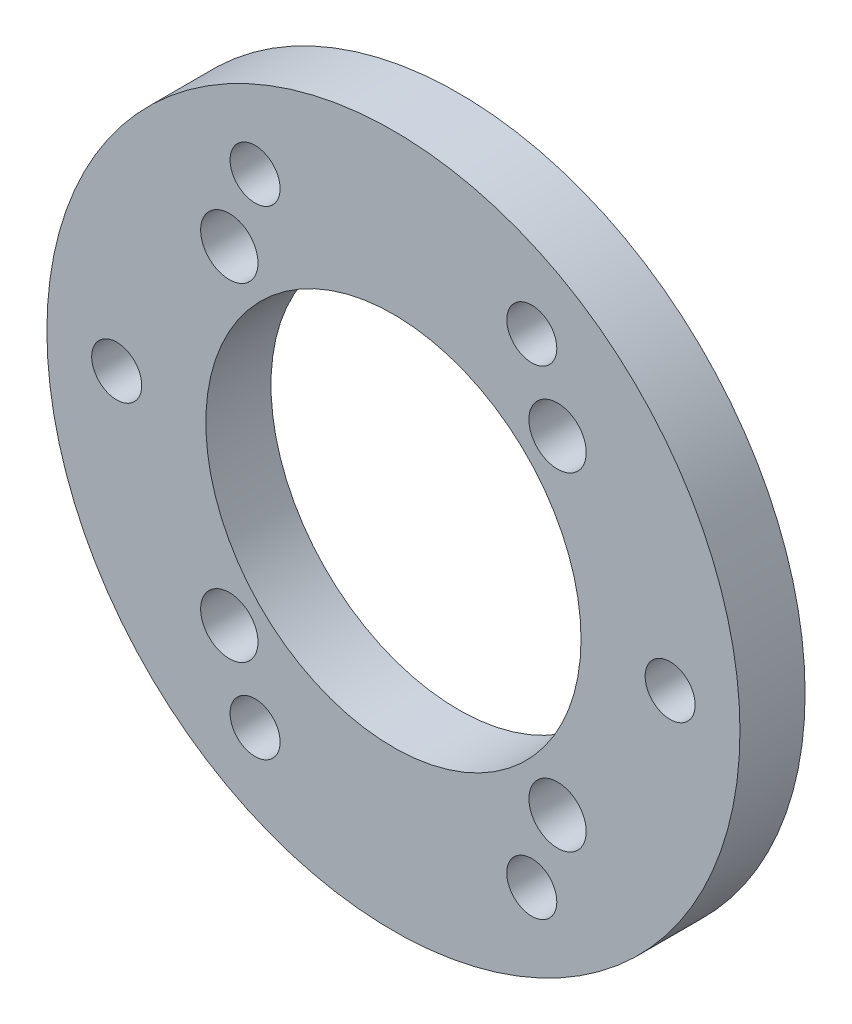
ISO-10303-21;
HEADER;
FILE_DESCRIPTION(('STEP AP214'),'2;1');
FILE_NAME('part.step','',(''),(''),'','','');
FILE_SCHEMA(('AUTOMOTIVE_DESIGN { 1 0 10303 214 1 1 1 1 }'));
ENDSEC;
DATA;
#1=APPLICATION_CONTEXT('core data for automotive mechanical design processes');
#2=APPLICATION_PROTOCOL_DEFINITION('international standard','automotive_design',2000,#1);
#3=PRODUCT_CONTEXT('',#1,'mechanical');
#4=PRODUCT('Part','Part','',(#3));
#5=PRODUCT_RELATED_PRODUCT_CATEGORY('part','',(#4));
#6=PRODUCT_DEFINITION_FORMATION('','',#4);
#7=PRODUCT_DEFINITION_CONTEXT('part definition',#1,'design');
#8=PRODUCT_DEFINITION('design','',#6,#7);
#9=PRODUCT_DEFINITION_SHAPE('','',#8);
#10=(LENGTH_UNIT() NAMED_UNIT(*) SI_UNIT(.MILLI.,.METRE.));
#11=(NAMED_UNIT(*) PLANE_ANGLE_UNIT() SI_UNIT($,.RADIAN.));
#12=(NAMED_UNIT(*) SI_UNIT($,.STERADIAN.) SOLID_ANGLE_UNIT());
#13=UNCERTAINTY_MEASURE_WITH_UNIT(LENGTH_MEASURE(1.E-05),#10,'distance_accuracy_value','');
#14=(GEOMETRIC_REPRESENTATION_CONTEXT(3) GLOBAL_UNCERTAINTY_ASSIGNED_CONTEXT((#13)) GLOBAL_UNIT_ASSIGNED_CONTEXT((#10,
#11,#12)) REPRESENTATION_CONTEXT('',''));
#15=CARTESIAN_POINT('',(0.,0.,0.));
#16=DIRECTION('',(0.,0.,1.));
#17=DIRECTION('',(1.,0.,0.));
#18=AXIS2_PLACEMENT_3D('',#15,#16,#17);
#19=CARTESIAN_POINT('',(0.,0.,3.175));
#20=DIRECTION('',(0.,0.,-1.));
#21=DIRECTION('',(-1.,0.,0.));
#22=AXIS2_PLACEMENT_3D('',#19,#20,#21);
#23=CYLINDRICAL_SURFACE('',#22,16.891);
#24=CARTESIAN_POINT('',(0.,0.,3.175));
#25=DIRECTION('',(0.,0.,1.));
#26=DIRECTION('',(1.,0.,0.));
#27=AXIS2_PLACEMENT_3D('',#24,#25,#26);
#28=CIRCLE('',#27,16.891);
#29=CARTESIAN_POINT('',(16.891,0.,3.175));
#30=VERTEX_POINT('',#29);
#31=EDGE_CURVE('E13',#30,#30,#28,.T.);
#32=ORIENTED_EDGE('',*,*,#31,.F.);
#33=EDGE_LOOP('',(#32));
#34=FACE_BOUND('',#33,.T.);
#35=CARTESIAN_POINT('',(0.,0.,0.));
#36=DIRECTION('',(0.,0.,1.));
#37=DIRECTION('',(1.,0.,0.));
#38=AXIS2_PLACEMENT_3D('',#35,#36,#37);
#39=CIRCLE('',#38,16.891);
#40=CARTESIAN_POINT('',(16.891,0.,0.));
#41=VERTEX_POINT('',#40);
#42=EDGE_CURVE('E61',#41,#41,#39,.T.);
#43=ORIENTED_EDGE('',*,*,#42,.T.);
#44=EDGE_LOOP('',(#43));
#45=FACE_BOUND('',#44,.T.);
#46=ADVANCED_FACE('F58',(#34,#45),#23,.T.);
#47=CARTESIAN_POINT('',(0.,0.,3.175));
#48=DIRECTION('',(0.,0.,1.));
#49=DIRECTION('',(1.,0.,0.));
#50=AXIS2_PLACEMENT_3D('',#47,#48,#49);
#51=PLANE('',#50);
#52=CARTESIAN_POINT('',(0.,0.,3.175));
#53=DIRECTION('',(0.,0.,1.));
#54=DIRECTION('',(1.,0.,0.));
#55=AXIS2_PLACEMENT_3D('',#52,#53,#54);
#56=CIRCLE('',#55,9.144);
#57=CARTESIAN_POINT('',(9.144,0.,3.175));
#58=VERTEX_POINT('',#57);
#59=EDGE_CURVE('E130',#58,#58,#56,.T.);
#60=ORIENTED_EDGE('',*,*,#59,.F.);
#61=EDGE_LOOP('',(#60));
#62=FACE_BOUND('',#61,.T.);
#63=CARTESIAN_POINT('',(8.,8.,3.175));
#64=DIRECTION('',(0.,0.,1.));
#65=DIRECTION('',(1.,0.,0.));
#66=AXIS2_PLACEMENT_3D('',#63,#64,#65);
#67=CIRCLE('',#66,1.397);
#68=CARTESIAN_POINT('',(9.397,8.,3.175));
#69=VERTEX_POINT('',#68);
#70=EDGE_CURVE('E126',#69,#69,#67,.T.);
#71=ORIENTED_EDGE('',*,*,#70,.F.);
#72=EDGE_LOOP('',(#71));
#73=FACE_BOUND('',#72,.T.);
#74=CARTESIAN_POINT('',(-8.,-8.,3.175));
#75=DIRECTION('',(0.,0.,1.));
#76=DIRECTION('',(1.,0.,0.));
#77=AXIS2_PLACEMENT_3D('',#74,#75,#76);
#78=CIRCLE('',#77,1.397);
#79=CARTESIAN_POINT('',(-6.603,-8.,3.175));
#80=VERTEX_POINT('',#79);
#81=EDGE_CURVE('E120',#80,#80,#78,.T.);
#82=ORIENTED_EDGE('',*,*,#81,.F.);
#83=EDGE_LOOP('',(#82));
#84=FACE_BOUND('',#83,.T.);
#85=CARTESIAN_POINT('',(8.,-8.,3.175));
#86=DIRECTION('',(0.,0.,1.));
#87=DIRECTION('',(1.,0.,0.));
#88=AXIS2_PLACEMENT_3D('',#85,#86,#87);
#89=CIRCLE('',#88,1.397);
#90=CARTESIAN_POINT('',(9.397,-8.,3.175));
#91=VERTEX_POINT('',#90);
#92=EDGE_CURVE('E114',#91,#91,#89,.T.);
#93=ORIENTED_EDGE('',*,*,#92,.F.);
#94=EDGE_LOOP('',(#93));
#95=FACE_BOUND('',#94,.T.);
#96=CARTESIAN_POINT('',(-8.,8.,3.175));
#97=DIRECTION('',(0.,0.,1.));
#98=DIRECTION('',(1.,0.,0.));
#99=AXIS2_PLACEMENT_3D('',#96,#97,#98);
#100=CIRCLE('',#99,1.397);
#101=CARTESIAN_POINT('',(-6.603,8.,3.175));
#102=VERTEX_POINT('',#101);
#103=EDGE_CURVE('E108',#102,#102,#100,.T.);
#104=ORIENTED_EDGE('',*,*,#103,.F.);
#105=EDGE_LOOP('',(#104));
#106=FACE_BOUND('',#105,.T.);
#107=CARTESIAN_POINT('',(6.74370000000014,-11.6804310310022,3.175));
#108=DIRECTION('',(0.,0.,1.));
#109=DIRECTION('',(1.,0.,0.));
#110=AXIS2_PLACEMENT_3D('',#107,#108,#109);
#111=CIRCLE('',#110,1.2192);
#112=CARTESIAN_POINT('',(7.96290000000014,-11.6804310310022,3.175));
#113=VERTEX_POINT('',#112);
#114=EDGE_CURVE('E102',#113,#113,#111,.T.);
#115=ORIENTED_EDGE('',*,*,#114,.F.);
#116=EDGE_LOOP('',(#115));
#117=FACE_BOUND('',#116,.T.);
#118=CARTESIAN_POINT('',(-6.74369999999989,-11.6804310310023,3.175));
#119=DIRECTION('',(0.,0.,1.));
#120=DIRECTION('',(1.,0.,0.));
#121=AXIS2_PLACEMENT_3D('',#118,#119,#120);
#122=CIRCLE('',#121,1.2192);
#123=CARTESIAN_POINT('',(-5.52449999999989,-11.6804310310023,3.175));
#124=VERTEX_POINT('',#123);
#125=EDGE_CURVE('E96',#124,#124,#122,.T.);
#126=ORIENTED_EDGE('',*,*,#125,.F.);
#127=EDGE_LOOP('',(#126));
#128=FACE_BOUND('',#127,.T.);
#129=CARTESIAN_POINT('',(-13.4874,0.,3.175));
#130=DIRECTION('',(0.,0.,1.));
#131=DIRECTION('',(1.,0.,0.));
#132=AXIS2_PLACEMENT_3D('',#129,#130,#131);
#133=CIRCLE('',#132,1.2192);
#134=CARTESIAN_POINT('',(-12.2682,0.,3.175));
#135=VERTEX_POINT('',#134);
#136=EDGE_CURVE('E90',#135,#135,#133,.T.);
#137=ORIENTED_EDGE('',*,*,#136,.F.);
#138=EDGE_LOOP('',(#137));
#139=FACE_BOUND('',#138,.T.);
#140=CARTESIAN_POINT('',(-6.74370000000006,11.6804310310022,3.175));
#141=DIRECTION('',(0.,0.,1.));
#142=DIRECTION('',(1.,0.,0.));
#143=AXIS2_PLACEMENT_3D('',#140,#141,#142);
#144=CIRCLE('',#143,1.2192);
#145=CARTESIAN_POINT('',(-5.52450000000006,11.6804310310022,3.175));
#146=VERTEX_POINT('',#145);
#147=EDGE_CURVE('E84',#146,#146,#144,.T.);
#148=ORIENTED_EDGE('',*,*,#147,.F.);
#149=EDGE_LOOP('',(#148));
#150=FACE_BOUND('',#149,.T.);
#151=CARTESIAN_POINT('',(6.74369999999997,11.6804310310023,3.175));
#152=DIRECTION('',(0.,0.,1.));
#153=DIRECTION('',(1.,0.,0.));
#154=AXIS2_PLACEMENT_3D('',#151,#152,#153);
#155=CIRCLE('',#154,1.2192);
#156=CARTESIAN_POINT('',(7.96289999999997,11.6804310310023,3.175));
#157=VERTEX_POINT('',#156);
#158=EDGE_CURVE('E78',#157,#157,#155,.T.);
#159=ORIENTED_EDGE('',*,*,#158,.F.);
#160=EDGE_LOOP('',(#159));
#161=FACE_BOUND('',#160,.T.);
#162=CARTESIAN_POINT('',(13.4874,0.,3.175));
#163=DIRECTION('',(0.,0.,1.));
#164=DIRECTION('',(1.,0.,0.));
#165=AXIS2_PLACEMENT_3D('',#162,#163,#164);
#166=CIRCLE('',#165,1.2192);
#167=CARTESIAN_POINT('',(14.7066,0.,3.175));
#168=VERTEX_POINT('',#167);
#169=EDGE_CURVE('E72',#168,#168,#166,.T.);
#170=ORIENTED_EDGE('',*,*,#169,.F.);
#171=EDGE_LOOP('',(#170));
#172=FACE_BOUND('',#171,.T.);
#173=ORIENTED_EDGE('',*,*,#31,.T.);
#174=EDGE_LOOP('',(#173));
#175=FACE_BOUND('',#174,.T.);
#176=ADVANCED_FACE('F146',(#62,#73,#84,#95,#106,#117,#128,#139,#150,#161,#172,#175),#51,.T.);
#177=CARTESIAN_POINT('',(0.,0.,0.));
#178=DIRECTION('',(0.,0.,1.));
#179=DIRECTION('',(1.,0.,0.));
#180=AXIS2_PLACEMENT_3D('',#177,#178,#179);
#181=PLANE('',#180);
#182=CARTESIAN_POINT('',(0.,0.,0.));
#183=DIRECTION('',(0.,0.,1.));
#184=DIRECTION('',(1.,0.,0.));
#185=AXIS2_PLACEMENT_3D('',#182,#183,#184);
#186=CIRCLE('',#185,9.144);
#187=CARTESIAN_POINT('',(9.144,0.,0.));
#188=VERTEX_POINT('',#187);
#189=EDGE_CURVE('E129',#188,#188,#186,.T.);
#190=ORIENTED_EDGE('',*,*,#189,.T.);
#191=EDGE_LOOP('',(#190));
#192=FACE_BOUND('',#191,.T.);
#193=CARTESIAN_POINT('',(8.,8.,0.));
#194=DIRECTION('',(0.,0.,1.));
#195=DIRECTION('',(1.,0.,0.));
#196=AXIS2_PLACEMENT_3D('',#193,#194,#195);
#197=CIRCLE('',#196,1.397);
#198=CARTESIAN_POINT('',(9.397,8.,0.));
#199=VERTEX_POINT('',#198);
#200=EDGE_CURVE('E123',#199,#199,#197,.T.);
#201=ORIENTED_EDGE('',*,*,#200,.T.);
#202=EDGE_LOOP('',(#201));
#203=FACE_BOUND('',#202,.T.);
#204=CARTESIAN_POINT('',(-8.,-8.,0.));
#205=DIRECTION('',(0.,0.,1.));
#206=DIRECTION('',(1.,0.,0.));
#207=AXIS2_PLACEMENT_3D('',#204,#205,#206);
#208=CIRCLE('',#207,1.397);
#209=CARTESIAN_POINT('',(-6.603,-8.,0.));
#210=VERTEX_POINT('',#209);
#211=EDGE_CURVE('E117',#210,#210,#208,.T.);
#212=ORIENTED_EDGE('',*,*,#211,.T.);
#213=EDGE_LOOP('',(#212));
#214=FACE_BOUND('',#213,.T.);
#215=CARTESIAN_POINT('',(8.,-8.,0.));
#216=DIRECTION('',(0.,0.,1.));
#217=DIRECTION('',(1.,0.,0.));
#218=AXIS2_PLACEMENT_3D('',#215,#216,#217);
#219=CIRCLE('',#218,1.397);
#220=CARTESIAN_POINT('',(9.397,-8.,0.));
#221=VERTEX_POINT('',#220);
#222=EDGE_CURVE('E111',#221,#221,#219,.T.);
#223=ORIENTED_EDGE('',*,*,#222,.T.);
#224=EDGE_LOOP('',(#223));
#225=FACE_BOUND('',#224,.T.);
#226=CARTESIAN_POINT('',(-8.,8.,0.));
#227=DIRECTION('',(0.,0.,1.));
#228=DIRECTION('',(1.,0.,0.));
#229=AXIS2_PLACEMENT_3D('',#226,#227,#228);
#230=CIRCLE('',#229,1.397);
#231=CARTESIAN_POINT('',(-6.603,8.,0.));
#232=VERTEX_POINT('',#231);
#233=EDGE_CURVE('E105',#232,#232,#230,.T.);
#234=ORIENTED_EDGE('',*,*,#233,.T.);
#235=EDGE_LOOP('',(#234));
#236=FACE_BOUND('',#235,.T.);
#237=CARTESIAN_POINT('',(6.74370000000014,-11.6804310310022,0.));
#238=DIRECTION('',(0.,0.,1.));
#239=DIRECTION('',(1.,0.,0.));
#240=AXIS2_PLACEMENT_3D('',#237,#238,#239);
#241=CIRCLE('',#240,1.2192);
#242=CARTESIAN_POINT('',(7.96290000000014,-11.6804310310022,0.));
#243=VERTEX_POINT('',#242);
#244=EDGE_CURVE('E99',#243,#243,#241,.T.);
#245=ORIENTED_EDGE('',*,*,#244,.T.);
#246=EDGE_LOOP('',(#245));
#247=FACE_BOUND('',#246,.T.);
#248=CARTESIAN_POINT('',(-6.74369999999989,-11.6804310310023,0.));
#249=DIRECTION('',(0.,0.,1.));
#250=DIRECTION('',(1.,0.,0.));
#251=AXIS2_PLACEMENT_3D('',#248,#249,#250);
#252=CIRCLE('',#251,1.2192);
#253=CARTESIAN_POINT('',(-5.52449999999989,-11.6804310310023,0.));
#254=VERTEX_POINT('',#253);
#255=EDGE_CURVE('E93',#254,#254,#252,.T.);
#256=ORIENTED_EDGE('',*,*,#255,.T.);
#257=EDGE_LOOP('',(#256));
#258=FACE_BOUND('',#257,.T.);
#259=CARTESIAN_POINT('',(-13.4874,0.,0.));
#260=DIRECTION('',(0.,0.,1.));
#261=DIRECTION('',(1.,0.,0.));
#262=AXIS2_PLACEMENT_3D('',#259,#260,#261);
#263=CIRCLE('',#262,1.2192);
#264=CARTESIAN_POINT('',(-12.2682,0.,0.));
#265=VERTEX_POINT('',#264);
#266=EDGE_CURVE('E87',#265,#265,#263,.T.);
#267=ORIENTED_EDGE('',*,*,#266,.T.);
#268=EDGE_LOOP('',(#267));
#269=FACE_BOUND('',#268,.T.);
#270=CARTESIAN_POINT('',(-6.74370000000006,11.6804310310022,0.));
#271=DIRECTION('',(0.,0.,1.));
#272=DIRECTION('',(1.,0.,0.));
#273=AXIS2_PLACEMENT_3D('',#270,#271,#272);
#274=CIRCLE('',#273,1.2192);
#275=CARTESIAN_POINT('',(-5.52450000000006,11.6804310310022,0.));
#276=VERTEX_POINT('',#275);
#277=EDGE_CURVE('E81',#276,#276,#274,.T.);
#278=ORIENTED_EDGE('',*,*,#277,.T.);
#279=EDGE_LOOP('',(#278));
#280=FACE_BOUND('',#279,.T.);
#281=CARTESIAN_POINT('',(6.74369999999997,11.6804310310023,0.));
#282=DIRECTION('',(0.,0.,1.));
#283=DIRECTION('',(1.,0.,0.));
#284=AXIS2_PLACEMENT_3D('',#281,#282,#283);
#285=CIRCLE('',#284,1.2192);
#286=CARTESIAN_POINT('',(7.96289999999997,11.6804310310023,0.));
#287=VERTEX_POINT('',#286);
#288=EDGE_CURVE('E75',#287,#287,#285,.T.);
#289=ORIENTED_EDGE('',*,*,#288,.T.);
#290=EDGE_LOOP('',(#289));
#291=FACE_BOUND('',#290,.T.);
#292=CARTESIAN_POINT('',(13.4874,0.,0.));
#293=DIRECTION('',(0.,0.,1.));
#294=DIRECTION('',(1.,0.,0.));
#295=AXIS2_PLACEMENT_3D('',#292,#293,#294);
#296=CIRCLE('',#295,1.2192);
#297=CARTESIAN_POINT('',(14.7066,0.,0.));
#298=VERTEX_POINT('',#297);
#299=EDGE_CURVE('E68',#298,#298,#296,.T.);
#300=ORIENTED_EDGE('',*,*,#299,.T.);
#301=EDGE_LOOP('',(#300));
#302=FACE_BOUND('',#301,.T.);
#303=ORIENTED_EDGE('',*,*,#42,.F.);
#304=EDGE_LOOP('',(#303));
#305=FACE_BOUND('',#304,.T.);
#306=ADVANCED_FACE('F136',(#192,#203,#214,#225,#236,#247,#258,#269,#280,#291,#302,#305),#181,.F.);
#307=CARTESIAN_POINT('',(13.4874,0.,3.175));
#308=DIRECTION('',(0.,0.,1.));
#309=DIRECTION('',(1.,0.,0.));
#310=AXIS2_PLACEMENT_3D('',#307,#308,#309);
#311=CYLINDRICAL_SURFACE('',#310,1.2192);
#312=ORIENTED_EDGE('',*,*,#299,.F.);
#313=EDGE_LOOP('',(#312));
#314=FACE_BOUND('',#313,.T.);
#315=ORIENTED_EDGE('',*,*,#169,.T.);
#316=EDGE_LOOP('',(#315));
#317=FACE_BOUND('',#316,.T.);
#318=ADVANCED_FACE('F170',(#314,#317),#311,.F.);
#319=CARTESIAN_POINT('',(6.74369999999997,11.6804310310023,3.175));
#320=DIRECTION('',(0.,0.,1.));
#321=DIRECTION('',(1.,0.,0.));
#322=AXIS2_PLACEMENT_3D('',#319,#320,#321);
#323=CYLINDRICAL_SURFACE('',#322,1.2192);
#324=ORIENTED_EDGE('',*,*,#288,.F.);
#325=EDGE_LOOP('',(#324));
#326=FACE_BOUND('',#325,.T.);
#327=ORIENTED_EDGE('',*,*,#158,.T.);
#328=EDGE_LOOP('',(#327));
#329=FACE_BOUND('',#328,.T.);
#330=ADVANCED_FACE('F172',(#326,#329),#323,.F.);
#331=CARTESIAN_POINT('',(-6.74370000000006,11.6804310310022,3.175));
#332=DIRECTION('',(0.,0.,1.));
#333=DIRECTION('',(1.,0.,0.));
#334=AXIS2_PLACEMENT_3D('',#331,#332,#333);
#335=CYLINDRICAL_SURFACE('',#334,1.2192);
#336=ORIENTED_EDGE('',*,*,#277,.F.);
#337=EDGE_LOOP('',(#336));
#338=FACE_BOUND('',#337,.T.);
#339=ORIENTED_EDGE('',*,*,#147,.T.);
#340=EDGE_LOOP('',(#339));
#341=FACE_BOUND('',#340,.T.);
#342=ADVANCED_FACE('F179',(#338,#341),#335,.F.);
#343=CARTESIAN_POINT('',(-13.4874,0.,3.175));
#344=DIRECTION('',(0.,0.,1.));
#345=DIRECTION('',(1.,0.,0.));
#346=AXIS2_PLACEMENT_3D('',#343,#344,#345);
#347=CYLINDRICAL_SURFACE('',#346,1.2192);
#348=ORIENTED_EDGE('',*,*,#266,.F.);
#349=EDGE_LOOP('',(#348));
#350=FACE_BOUND('',#349,.T.);
#351=ORIENTED_EDGE('',*,*,#136,.T.);
#352=EDGE_LOOP('',(#351));
#353=FACE_BOUND('',#352,.T.);
#354=ADVANCED_FACE('F223',(#350,#353),#347,.F.);
#355=CARTESIAN_POINT('',(-6.74369999999989,-11.6804310310023,3.175));
#356=DIRECTION('',(0.,0.,1.));
#357=DIRECTION('',(1.,0.,0.));
#358=AXIS2_PLACEMENT_3D('',#355,#356,#357);
#359=CYLINDRICAL_SURFACE('',#358,1.2192);
#360=ORIENTED_EDGE('',*,*,#255,.F.);
#361=EDGE_LOOP('',(#360));
#362=FACE_BOUND('',#361,.T.);
#363=ORIENTED_EDGE('',*,*,#125,.T.);
#364=EDGE_LOOP('',(#363));
#365=FACE_BOUND('',#364,.T.);
#366=ADVANCED_FACE('F233',(#362,#365),#359,.F.);
#367=CARTESIAN_POINT('',(6.74370000000014,-11.6804310310022,3.175));
#368=DIRECTION('',(0.,0.,1.));
#369=DIRECTION('',(1.,0.,0.));
#370=AXIS2_PLACEMENT_3D('',#367,#368,#369);
#371=CYLINDRICAL_SURFACE('',#370,1.2192);
#372=ORIENTED_EDGE('',*,*,#244,.F.);
#373=EDGE_LOOP('',(#372));
#374=FACE_BOUND('',#373,.T.);
#375=ORIENTED_EDGE('',*,*,#114,.T.);
#376=EDGE_LOOP('',(#375));
#377=FACE_BOUND('',#376,.T.);
#378=ADVANCED_FACE('F243',(#374,#377),#371,.F.);
#379=CARTESIAN_POINT('',(-8.,8.,3.175));
#380=DIRECTION('',(0.,0.,1.));
#381=DIRECTION('',(1.,0.,0.));
#382=AXIS2_PLACEMENT_3D('',#379,#380,#381);
#383=CYLINDRICAL_SURFACE('',#382,1.397);
#384=ORIENTED_EDGE('',*,*,#233,.F.);
#385=EDGE_LOOP('',(#384));
#386=FACE_BOUND('',#385,.T.);
#387=ORIENTED_EDGE('',*,*,#103,.T.);
#388=EDGE_LOOP('',(#387));
#389=FACE_BOUND('',#388,.T.);
#390=ADVANCED_FACE('F253',(#386,#389),#383,.F.);
#391=CARTESIAN_POINT('',(8.,-8.,3.175));
#392=DIRECTION('',(0.,0.,1.));
#393=DIRECTION('',(1.,0.,0.));
#394=AXIS2_PLACEMENT_3D('',#391,#392,#393);
#395=CYLINDRICAL_SURFACE('',#394,1.397);
#396=ORIENTED_EDGE('',*,*,#222,.F.);
#397=EDGE_LOOP('',(#396));
#398=FACE_BOUND('',#397,.T.);
#399=ORIENTED_EDGE('',*,*,#92,.T.);
#400=EDGE_LOOP('',(#399));
#401=FACE_BOUND('',#400,.T.);
#402=ADVANCED_FACE('F263',(#398,#401),#395,.F.);
#403=CARTESIAN_POINT('',(-8.,-8.,3.175));
#404=DIRECTION('',(0.,0.,1.));
#405=DIRECTION('',(1.,0.,0.));
#406=AXIS2_PLACEMENT_3D('',#403,#404,#405);
#407=CYLINDRICAL_SURFACE('',#406,1.397);
#408=ORIENTED_EDGE('',*,*,#211,.F.);
#409=EDGE_LOOP('',(#408));
#410=FACE_BOUND('',#409,.T.);
#411=ORIENTED_EDGE('',*,*,#81,.T.);
#412=EDGE_LOOP('',(#411));
#413=FACE_BOUND('',#412,.T.);
#414=ADVANCED_FACE('F273',(#410,#413),#407,.F.);
#415=CARTESIAN_POINT('',(8.,8.,3.175));
#416=DIRECTION('',(0.,0.,1.));
#417=DIRECTION('',(1.,0.,0.));
#418=AXIS2_PLACEMENT_3D('',#415,#416,#417);
#419=CYLINDRICAL_SURFACE('',#418,1.397);
#420=ORIENTED_EDGE('',*,*,#200,.F.);
#421=EDGE_LOOP('',(#420));
#422=FACE_BOUND('',#421,.T.);
#423=ORIENTED_EDGE('',*,*,#70,.T.);
#424=EDGE_LOOP('',(#423));
#425=FACE_BOUND('',#424,.T.);
#426=ADVANCED_FACE('F142',(#422,#425),#419,.F.);
#427=CARTESIAN_POINT('',(0.,0.,0.));
#428=DIRECTION('',(0.,0.,1.));
#429=DIRECTION('',(1.,0.,0.));
#430=AXIS2_PLACEMENT_3D('',#427,#428,#429);
#431=CYLINDRICAL_SURFACE('',#430,9.144);
#432=ORIENTED_EDGE('',*,*,#189,.F.);
#433=EDGE_LOOP('',(#432));
#434=FACE_BOUND('',#433,.T.);
#435=ORIENTED_EDGE('',*,*,#59,.T.);
#436=EDGE_LOOP('',(#435));
#437=FACE_BOUND('',#436,.T.);
#438=ADVANCED_FACE('F139',(#434,#437),#431,.F.);
#439=CLOSED_SHELL('',(#46,#176,#306,#318,#330,#342,#354,#366,#378,#390,#402,#414,#426,#438));
#440=MANIFOLD_SOLID_BREP('B2',#439);
#441=ADVANCED_BREP_SHAPE_REPRESENTATION('',(#18,#440),#14);
#442=SHAPE_DEFINITION_REPRESENTATION(#9,#441);
ENDSEC;
END-ISO-10303-21;
